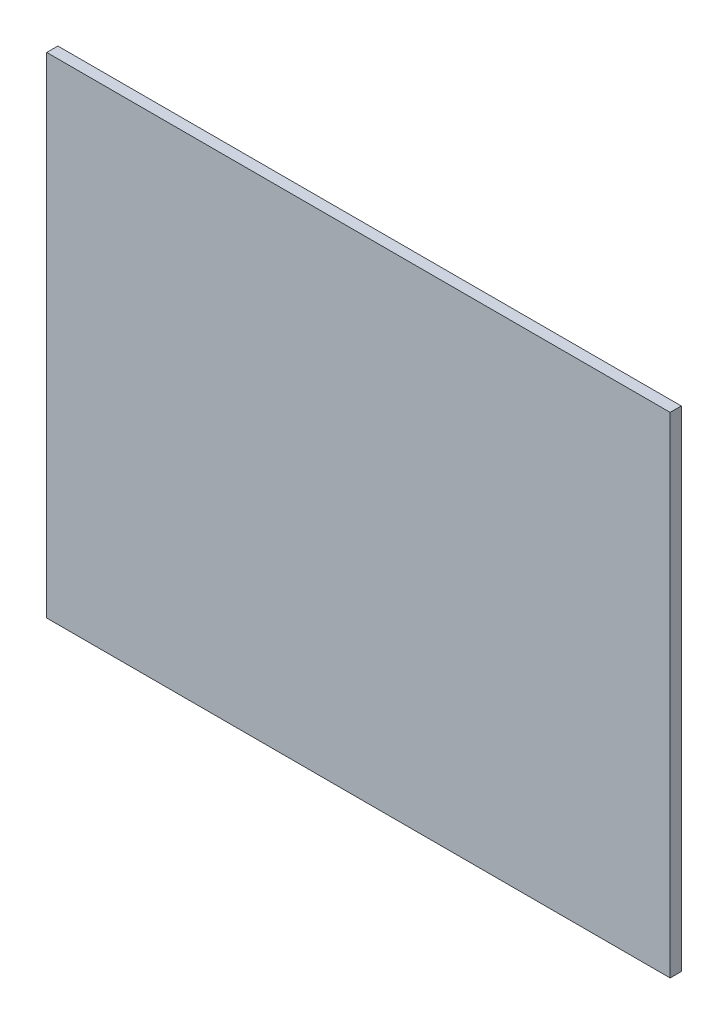
ISO-10303-21;
HEADER;
FILE_DESCRIPTION(('STEP AP214'),'2;1');
FILE_NAME('part.step','',(''),(''),'','','');
FILE_SCHEMA(('AUTOMOTIVE_DESIGN { 1 0 10303 214 1 1 1 1 }'));
ENDSEC;
DATA;
#1=APPLICATION_CONTEXT('core data for automotive mechanical design processes');
#2=APPLICATION_PROTOCOL_DEFINITION('international standard','automotive_design',2000,#1);
#3=PRODUCT_CONTEXT('',#1,'mechanical');
#4=PRODUCT('Part','Part','',(#3));
#5=PRODUCT_RELATED_PRODUCT_CATEGORY('part','',(#4));
#6=PRODUCT_DEFINITION_FORMATION('','',#4);
#7=PRODUCT_DEFINITION_CONTEXT('part definition',#1,'design');
#8=PRODUCT_DEFINITION('design','',#6,#7);
#9=PRODUCT_DEFINITION_SHAPE('','',#8);
#10=(LENGTH_UNIT() NAMED_UNIT(*) SI_UNIT(.MILLI.,.METRE.));
#11=(NAMED_UNIT(*) PLANE_ANGLE_UNIT() SI_UNIT($,.RADIAN.));
#12=(NAMED_UNIT(*) SI_UNIT($,.STERADIAN.) SOLID_ANGLE_UNIT());
#13=UNCERTAINTY_MEASURE_WITH_UNIT(LENGTH_MEASURE(1.E-05),#10,'distance_accuracy_value','');
#14=(GEOMETRIC_REPRESENTATION_CONTEXT(3) GLOBAL_UNCERTAINTY_ASSIGNED_CONTEXT((#13)) GLOBAL_UNIT_ASSIGNED_CONTEXT((#10,
#11,#12)) REPRESENTATION_CONTEXT('',''));
#15=CARTESIAN_POINT('',(0.,0.,0.));
#16=DIRECTION('',(0.,0.,1.));
#17=DIRECTION('',(1.,0.,0.));
#18=AXIS2_PLACEMENT_3D('',#15,#16,#17);
#19=CARTESIAN_POINT('',(-177.8,-139.7,6.35));
#20=DIRECTION('',(1.,0.,0.));
#21=DIRECTION('',(0.,0.,-1.));
#22=AXIS2_PLACEMENT_3D('',#19,#20,#21);
#23=PLANE('',#22);
#24=DIRECTION('',(0.,-1.,0.));
#25=VECTOR('',#24,1.);
#26=CARTESIAN_POINT('',(-177.8,-139.7,0.));
#27=LINE('',#26,#25);
#28=CARTESIAN_POINT('',(-177.8,139.7,0.));
#29=VERTEX_POINT('',#28);
#30=CARTESIAN_POINT('',(-177.8,-139.7,0.));
#31=VERTEX_POINT('',#30);
#32=EDGE_CURVE('E107',#29,#31,#27,.T.);
#33=ORIENTED_EDGE('',*,*,#32,.T.);
#34=DIRECTION('',(0.,0.,-1.));
#35=VECTOR('',#34,1.);
#36=CARTESIAN_POINT('',(-177.8,-139.7,6.35));
#37=LINE('',#36,#35);
#38=CARTESIAN_POINT('',(-177.8,-139.7,6.35));
#39=VERTEX_POINT('',#38);
#40=EDGE_CURVE('E11',#39,#31,#37,.T.);
#41=ORIENTED_EDGE('',*,*,#40,.F.);
#42=DIRECTION('',(0.,-1.,0.));
#43=VECTOR('',#42,1.);
#44=CARTESIAN_POINT('',(-177.8,-139.7,6.35));
#45=LINE('',#44,#43);
#46=CARTESIAN_POINT('',(-177.8,139.7,6.35));
#47=VERTEX_POINT('',#46);
#48=EDGE_CURVE('E91',#47,#39,#45,.T.);
#49=ORIENTED_EDGE('',*,*,#48,.F.);
#50=DIRECTION('',(0.,0.,-1.));
#51=VECTOR('',#50,1.);
#52=CARTESIAN_POINT('',(-177.8,139.7,6.35));
#53=LINE('',#52,#51);
#54=EDGE_CURVE('E103',#47,#29,#53,.T.);
#55=ORIENTED_EDGE('',*,*,#54,.T.);
#56=EDGE_LOOP('',(#33,#41,#49,#55));
#57=FACE_BOUND('',#56,.T.);
#58=ADVANCED_FACE('F39',(#57),#23,.F.);
#59=CARTESIAN_POINT('',(177.8,-139.7,6.35));
#60=DIRECTION('',(0.,1.,0.));
#61=DIRECTION('',(-1.,0.,0.));
#62=AXIS2_PLACEMENT_3D('',#59,#60,#61);
#63=PLANE('',#62);
#64=DIRECTION('',(1.,0.,0.));
#65=VECTOR('',#64,1.);
#66=CARTESIAN_POINT('',(177.8,-139.7,0.));
#67=LINE('',#66,#65);
#68=CARTESIAN_POINT('',(177.8,-139.7,0.));
#69=VERTEX_POINT('',#68);
#70=EDGE_CURVE('E96',#31,#69,#67,.T.);
#71=ORIENTED_EDGE('',*,*,#70,.T.);
#72=DIRECTION('',(0.,0.,-1.));
#73=VECTOR('',#72,1.);
#74=CARTESIAN_POINT('',(177.8,-139.7,6.35));
#75=LINE('',#74,#73);
#76=CARTESIAN_POINT('',(177.8,-139.7,6.35));
#77=VERTEX_POINT('',#76);
#78=EDGE_CURVE('E48',#77,#69,#75,.T.);
#79=ORIENTED_EDGE('',*,*,#78,.F.);
#80=DIRECTION('',(1.,0.,0.));
#81=VECTOR('',#80,1.);
#82=CARTESIAN_POINT('',(177.8,-139.7,6.35));
#83=LINE('',#82,#81);
#84=EDGE_CURVE('E86',#39,#77,#83,.T.);
#85=ORIENTED_EDGE('',*,*,#84,.F.);
#86=ORIENTED_EDGE('',*,*,#40,.T.);
#87=EDGE_LOOP('',(#71,#79,#85,#86));
#88=FACE_BOUND('',#87,.T.);
#89=ADVANCED_FACE('F95',(#88),#63,.F.);
#90=CARTESIAN_POINT('',(177.8,-139.7,6.35));
#91=DIRECTION('',(-1.,0.,0.));
#92=DIRECTION('',(0.,0.,1.));
#93=AXIS2_PLACEMENT_3D('',#90,#91,#92);
#94=PLANE('',#93);
#95=DIRECTION('',(0.,1.,0.));
#96=VECTOR('',#95,1.);
#97=CARTESIAN_POINT('',(177.8,-139.7,0.));
#98=LINE('',#97,#96);
#99=CARTESIAN_POINT('',(177.8,139.7,0.));
#100=VERTEX_POINT('',#99);
#101=EDGE_CURVE('E73',#69,#100,#98,.T.);
#102=ORIENTED_EDGE('',*,*,#101,.T.);
#103=DIRECTION('',(0.,0.,-1.));
#104=VECTOR('',#103,1.);
#105=CARTESIAN_POINT('',(177.8,139.7,6.35));
#106=LINE('',#105,#104);
#107=CARTESIAN_POINT('',(177.8,139.7,6.35));
#108=VERTEX_POINT('',#107);
#109=EDGE_CURVE('E98',#108,#100,#106,.T.);
#110=ORIENTED_EDGE('',*,*,#109,.F.);
#111=DIRECTION('',(0.,1.,0.));
#112=VECTOR('',#111,1.);
#113=CARTESIAN_POINT('',(177.8,-139.7,6.35));
#114=LINE('',#113,#112);
#115=EDGE_CURVE('E89',#77,#108,#114,.T.);
#116=ORIENTED_EDGE('',*,*,#115,.F.);
#117=ORIENTED_EDGE('',*,*,#78,.T.);
#118=EDGE_LOOP('',(#102,#110,#116,#117));
#119=FACE_BOUND('',#118,.T.);
#120=ADVANCED_FACE('F99',(#119),#94,.F.);
#121=CARTESIAN_POINT('',(177.8,139.7,6.35));
#122=DIRECTION('',(0.,-1.,0.));
#123=DIRECTION('',(1.,0.,0.));
#124=AXIS2_PLACEMENT_3D('',#121,#122,#123);
#125=PLANE('',#124);
#126=DIRECTION('',(-1.,0.,0.));
#127=VECTOR('',#126,1.);
#128=CARTESIAN_POINT('',(177.8,139.7,0.));
#129=LINE('',#128,#127);
#130=EDGE_CURVE('E79',#100,#29,#129,.T.);
#131=ORIENTED_EDGE('',*,*,#130,.T.);
#132=ORIENTED_EDGE('',*,*,#54,.F.);
#133=DIRECTION('',(-1.,0.,0.));
#134=VECTOR('',#133,1.);
#135=CARTESIAN_POINT('',(177.8,139.7,6.35));
#136=LINE('',#135,#134);
#137=EDGE_CURVE('E56',#108,#47,#136,.T.);
#138=ORIENTED_EDGE('',*,*,#137,.F.);
#139=ORIENTED_EDGE('',*,*,#109,.T.);
#140=EDGE_LOOP('',(#131,#132,#138,#139));
#141=FACE_BOUND('',#140,.T.);
#142=ADVANCED_FACE('F120',(#141),#125,.F.);
#143=CARTESIAN_POINT('',(0.,0.,6.35));
#144=DIRECTION('',(0.,0.,1.));
#145=DIRECTION('',(1.,0.,0.));
#146=AXIS2_PLACEMENT_3D('',#143,#144,#145);
#147=PLANE('',#146);
#148=ORIENTED_EDGE('',*,*,#48,.T.);
#149=ORIENTED_EDGE('',*,*,#84,.T.);
#150=ORIENTED_EDGE('',*,*,#115,.T.);
#151=ORIENTED_EDGE('',*,*,#137,.T.);
#152=EDGE_LOOP('',(#148,#149,#150,#151));
#153=FACE_BOUND('',#152,.T.);
#154=ADVANCED_FACE('F87',(#153),#147,.T.);
#155=CARTESIAN_POINT('',(0.,0.,0.));
#156=DIRECTION('',(0.,0.,1.));
#157=DIRECTION('',(1.,0.,0.));
#158=AXIS2_PLACEMENT_3D('',#155,#156,#157);
#159=PLANE('',#158);
#160=ORIENTED_EDGE('',*,*,#32,.F.);
#161=ORIENTED_EDGE('',*,*,#130,.F.);
#162=ORIENTED_EDGE('',*,*,#101,.F.);
#163=ORIENTED_EDGE('',*,*,#70,.F.);
#164=EDGE_LOOP('',(#160,#161,#162,#163));
#165=FACE_BOUND('',#164,.T.);
#166=ADVANCED_FACE('F123',(#165),#159,.F.);
#167=CLOSED_SHELL('',(#58,#89,#120,#142,#154,#166));
#168=MANIFOLD_SOLID_BREP('B2',#167);
#169=ADVANCED_BREP_SHAPE_REPRESENTATION('',(#18,#168),#14);
#170=SHAPE_DEFINITION_REPRESENTATION(#9,#169);
ENDSEC;
END-ISO-10303-21;
